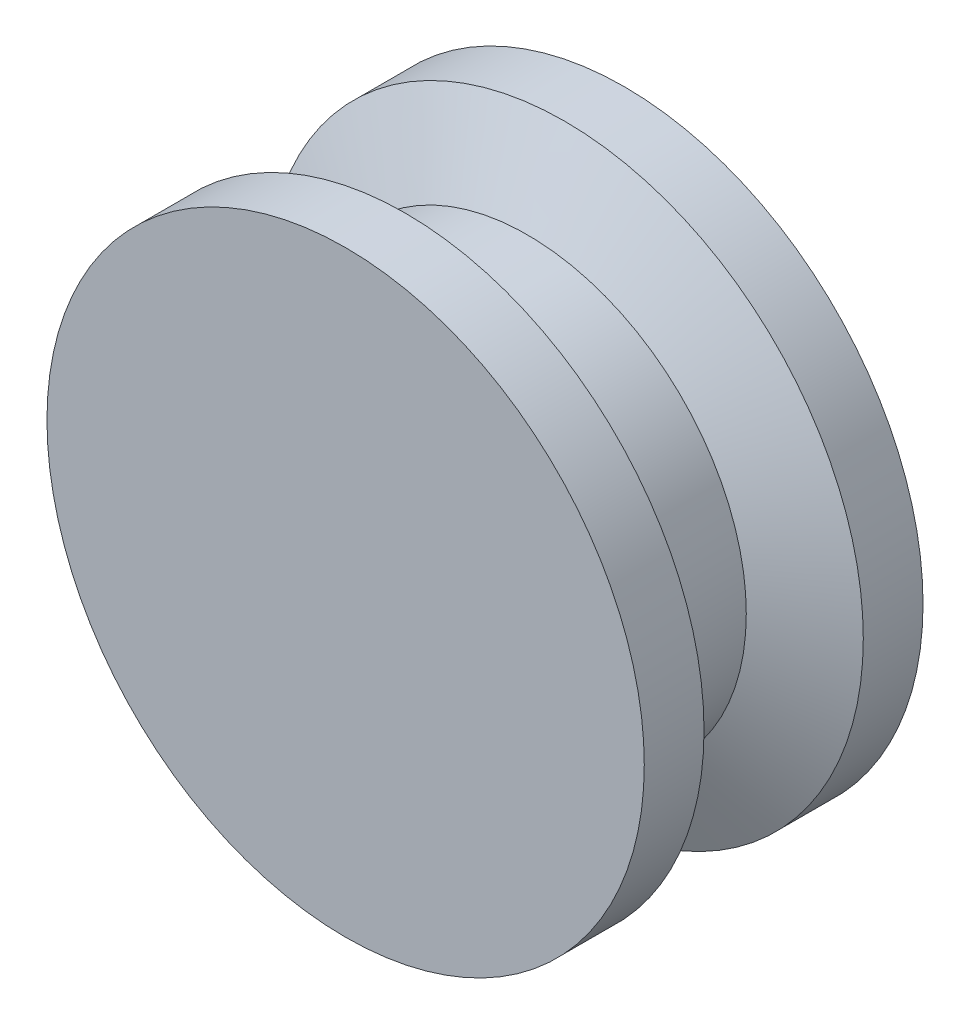
ISO-10303-21;
HEADER;
FILE_DESCRIPTION(('STEP AP214'),'2;1');
FILE_NAME('part.step','',(''),(''),'','','');
FILE_SCHEMA(('AUTOMOTIVE_DESIGN { 1 0 10303 214 1 1 1 1 }'));
ENDSEC;
DATA;
#1=APPLICATION_CONTEXT('core data for automotive mechanical design processes');
#2=APPLICATION_PROTOCOL_DEFINITION('international standard','automotive_design',2000,#1);
#3=PRODUCT_CONTEXT('',#1,'mechanical');
#4=PRODUCT('Part','Part','',(#3));
#5=PRODUCT_RELATED_PRODUCT_CATEGORY('part','',(#4));
#6=PRODUCT_DEFINITION_FORMATION('','',#4);
#7=PRODUCT_DEFINITION_CONTEXT('part definition',#1,'design');
#8=PRODUCT_DEFINITION('design','',#6,#7);
#9=PRODUCT_DEFINITION_SHAPE('','',#8);
#10=(LENGTH_UNIT() NAMED_UNIT(*) SI_UNIT(.MILLI.,.METRE.));
#11=(NAMED_UNIT(*) PLANE_ANGLE_UNIT() SI_UNIT($,.RADIAN.));
#12=(NAMED_UNIT(*) SI_UNIT($,.STERADIAN.) SOLID_ANGLE_UNIT());
#13=UNCERTAINTY_MEASURE_WITH_UNIT(LENGTH_MEASURE(1.E-05),#10,'distance_accuracy_value','');
#14=(GEOMETRIC_REPRESENTATION_CONTEXT(3) GLOBAL_UNCERTAINTY_ASSIGNED_CONTEXT((#13)) GLOBAL_UNIT_ASSIGNED_CONTEXT((#10,
#11,#12)) REPRESENTATION_CONTEXT('',''));
#15=CARTESIAN_POINT('',(0.,0.,0.));
#16=DIRECTION('',(0.,0.,1.));
#17=DIRECTION('',(1.,0.,0.));
#18=AXIS2_PLACEMENT_3D('',#15,#16,#17);
#19=CARTESIAN_POINT('',(0.,0.,70.));
#20=DIRECTION('',(0.,0.,-1.));
#21=DIRECTION('',(-1.,0.,0.));
#22=AXIS2_PLACEMENT_3D('',#19,#20,#21);
#23=PLANE('',#22);
#24=CARTESIAN_POINT('',(0.,0.,70.));
#25=DIRECTION('',(0.,0.,-1.));
#26=DIRECTION('',(-1.,0.,0.));
#27=AXIS2_PLACEMENT_3D('',#24,#25,#26);
#28=CIRCLE('',#27,150.);
#29=CARTESIAN_POINT('',(-150.,0.,70.));
#30=VERTEX_POINT('',#29);
#31=EDGE_CURVE('E10',#30,#30,#28,.T.);
#32=ORIENTED_EDGE('',*,*,#31,.F.);
#33=EDGE_LOOP('',(#32));
#34=FACE_BOUND('',#33,.T.);
#35=ADVANCED_FACE('F41',(#34),#23,.F.);
#36=CARTESIAN_POINT('',(0.,0.,-161.830826549408));
#37=DIRECTION('',(0.,0.,-1.));
#38=DIRECTION('',(-1.,0.,0.));
#39=AXIS2_PLACEMENT_3D('',#36,#37,#38);
#40=CYLINDRICAL_SURFACE('',#39,150.);
#41=CARTESIAN_POINT('',(0.,0.,40.));
#42=DIRECTION('',(0.,0.,-1.));
#43=DIRECTION('',(-1.,0.,0.));
#44=AXIS2_PLACEMENT_3D('',#41,#42,#43);
#45=CIRCLE('',#44,150.);
#46=CARTESIAN_POINT('',(-150.,0.,40.));
#47=VERTEX_POINT('',#46);
#48=EDGE_CURVE('E48',#47,#47,#45,.T.);
#49=ORIENTED_EDGE('',*,*,#48,.F.);
#50=EDGE_LOOP('',(#49));
#51=FACE_BOUND('',#50,.T.);
#52=ORIENTED_EDGE('',*,*,#31,.T.);
#53=EDGE_LOOP('',(#52));
#54=FACE_BOUND('',#53,.T.);
#55=ADVANCED_FACE('F95',(#51,#54),#40,.T.);
#56=CARTESIAN_POINT('',(0.,0.,40.));
#57=DIRECTION('',(0.,0.,1.));
#58=DIRECTION('',(1.,0.,0.));
#59=AXIS2_PLACEMENT_3D('',#56,#57,#58);
#60=CONICAL_SURFACE('',#59,150.,1.13446401379632);
#61=CARTESIAN_POINT('',(0.,0.,21.3104387366682));
#62=DIRECTION('',(0.,0.,-1.));
#63=DIRECTION('',(-1.,0.,0.));
#64=AXIS2_PLACEMENT_3D('',#61,#62,#63);
#65=CIRCLE('',#64,109.920106529497);
#66=CARTESIAN_POINT('',(-109.920106529497,0.,21.3104387366682));
#67=VERTEX_POINT('',#66);
#68=EDGE_CURVE('E53',#67,#67,#65,.T.);
#69=ORIENTED_EDGE('',*,*,#68,.F.);
#70=EDGE_LOOP('',(#69));
#71=FACE_BOUND('',#70,.T.);
#72=ORIENTED_EDGE('',*,*,#48,.T.);
#73=EDGE_LOOP('',(#72));
#74=FACE_BOUND('',#73,.T.);
#75=ADVANCED_FACE('F90',(#71,#74),#60,.T.);
#76=CARTESIAN_POINT('',(0.,0.,-161.830826549408));
#77=DIRECTION('',(0.,0.,-1.));
#78=DIRECTION('',(-1.,0.,0.));
#79=AXIS2_PLACEMENT_3D('',#76,#77,#78);
#80=CYLINDRICAL_SURFACE('',#79,109.920106529497);
#81=CARTESIAN_POINT('',(0.,0.,-21.3104387366682));
#82=DIRECTION('',(0.,0.,-1.));
#83=DIRECTION('',(-1.,0.,0.));
#84=AXIS2_PLACEMENT_3D('',#81,#82,#83);
#85=CIRCLE('',#84,109.920106529497);
#86=CARTESIAN_POINT('',(-109.920106529497,0.,-21.3104387366682));
#87=VERTEX_POINT('',#86);
#88=EDGE_CURVE('E58',#87,#87,#85,.T.);
#89=ORIENTED_EDGE('',*,*,#88,.F.);
#90=EDGE_LOOP('',(#89));
#91=FACE_BOUND('',#90,.T.);
#92=ORIENTED_EDGE('',*,*,#68,.T.);
#93=EDGE_LOOP('',(#92));
#94=FACE_BOUND('',#93,.T.);
#95=ADVANCED_FACE('F84',(#91,#94),#80,.T.);
#96=CARTESIAN_POINT('',(0.,0.,-21.3104387366682));
#97=DIRECTION('',(0.,0.,-1.));
#98=DIRECTION('',(-1.,0.,0.));
#99=AXIS2_PLACEMENT_3D('',#96,#97,#98);
#100=CONICAL_SURFACE('',#99,109.920106529497,1.13446401379632);
#101=CARTESIAN_POINT('',(0.,0.,-40.));
#102=DIRECTION('',(0.,0.,-1.));
#103=DIRECTION('',(-1.,0.,0.));
#104=AXIS2_PLACEMENT_3D('',#101,#102,#103);
#105=CIRCLE('',#104,150.);
#106=CARTESIAN_POINT('',(-150.,0.,-40.));
#107=VERTEX_POINT('',#106);
#108=EDGE_CURVE('E64',#107,#107,#105,.T.);
#109=ORIENTED_EDGE('',*,*,#108,.F.);
#110=EDGE_LOOP('',(#109));
#111=FACE_BOUND('',#110,.T.);
#112=ORIENTED_EDGE('',*,*,#88,.T.);
#113=EDGE_LOOP('',(#112));
#114=FACE_BOUND('',#113,.T.);
#115=ADVANCED_FACE('F78',(#111,#114),#100,.T.);
#116=CARTESIAN_POINT('',(0.,0.,-161.830826549408));
#117=DIRECTION('',(0.,0.,-1.));
#118=DIRECTION('',(-1.,0.,0.));
#119=AXIS2_PLACEMENT_3D('',#116,#117,#118);
#120=CYLINDRICAL_SURFACE('',#119,150.);
#121=CARTESIAN_POINT('',(0.,0.,-70.));
#122=DIRECTION('',(0.,0.,-1.));
#123=DIRECTION('',(-1.,0.,0.));
#124=AXIS2_PLACEMENT_3D('',#121,#122,#123);
#125=CIRCLE('',#124,150.);
#126=CARTESIAN_POINT('',(-150.,0.,-70.));
#127=VERTEX_POINT('',#126);
#128=EDGE_CURVE('E68',#127,#127,#125,.T.);
#129=ORIENTED_EDGE('',*,*,#128,.F.);
#130=EDGE_LOOP('',(#129));
#131=FACE_BOUND('',#130,.T.);
#132=ORIENTED_EDGE('',*,*,#108,.T.);
#133=EDGE_LOOP('',(#132));
#134=FACE_BOUND('',#133,.T.);
#135=ADVANCED_FACE('F75',(#131,#134),#120,.T.);
#136=CARTESIAN_POINT('',(0.,0.,-70.));
#137=DIRECTION('',(0.,0.,1.));
#138=DIRECTION('',(1.,0.,0.));
#139=AXIS2_PLACEMENT_3D('',#136,#137,#138);
#140=PLANE('',#139);
#141=ORIENTED_EDGE('',*,*,#128,.T.);
#142=EDGE_LOOP('',(#141));
#143=FACE_BOUND('',#142,.T.);
#144=ADVANCED_FACE('F73',(#143),#140,.F.);
#145=CLOSED_SHELL('',(#35,#55,#75,#95,#115,#135,#144));
#146=MANIFOLD_SOLID_BREP('B2',#145);
#147=ADVANCED_BREP_SHAPE_REPRESENTATION('',(#18,#146),#14);
#148=SHAPE_DEFINITION_REPRESENTATION(#9,#147);
ENDSEC;
END-ISO-10303-21;
